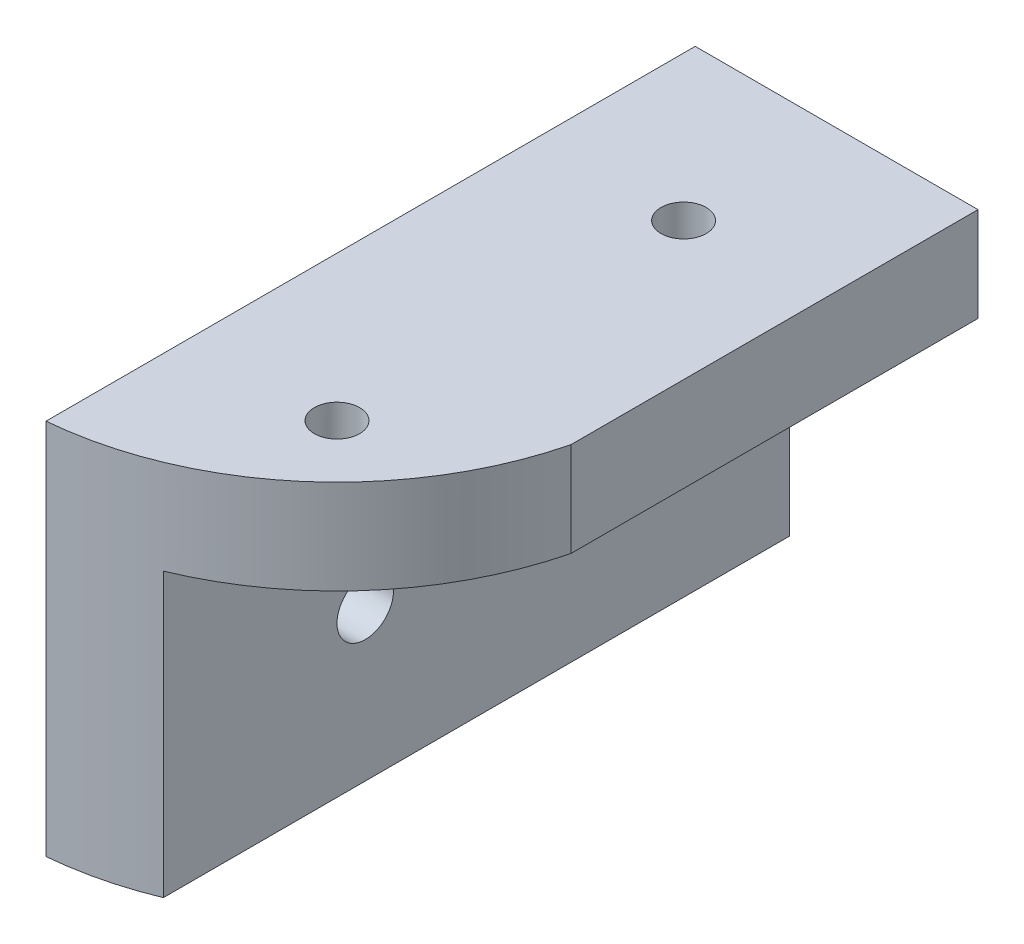
ISO-10303-21;
HEADER;
FILE_DESCRIPTION(('STEP AP214'),'2;1');
FILE_NAME('part.step','',(''),(''),'','','');
FILE_SCHEMA(('AUTOMOTIVE_DESIGN { 1 0 10303 214 1 1 1 1 }'));
ENDSEC;
DATA;
#1=APPLICATION_CONTEXT('core data for automotive mechanical design processes');
#2=APPLICATION_PROTOCOL_DEFINITION('international standard','automotive_design',2000,#1);
#3=PRODUCT_CONTEXT('',#1,'mechanical');
#4=PRODUCT('Part','Part','',(#3));
#5=PRODUCT_RELATED_PRODUCT_CATEGORY('part','',(#4));
#6=PRODUCT_DEFINITION_FORMATION('','',#4);
#7=PRODUCT_DEFINITION_CONTEXT('part definition',#1,'design');
#8=PRODUCT_DEFINITION('design','',#6,#7);
#9=PRODUCT_DEFINITION_SHAPE('','',#8);
#10=(LENGTH_UNIT() NAMED_UNIT(*) SI_UNIT(.MILLI.,.METRE.));
#11=(NAMED_UNIT(*) PLANE_ANGLE_UNIT() SI_UNIT($,.RADIAN.));
#12=(NAMED_UNIT(*) SI_UNIT($,.STERADIAN.) SOLID_ANGLE_UNIT());
#13=UNCERTAINTY_MEASURE_WITH_UNIT(LENGTH_MEASURE(1.E-05),#10,'distance_accuracy_value','');
#14=(GEOMETRIC_REPRESENTATION_CONTEXT(3) GLOBAL_UNCERTAINTY_ASSIGNED_CONTEXT((#13)) GLOBAL_UNIT_ASSIGNED_CONTEXT((#10,
#11,#12)) REPRESENTATION_CONTEXT('',''));
#15=CARTESIAN_POINT('',(0.,0.,0.));
#16=DIRECTION('',(0.,0.,1.));
#17=DIRECTION('',(1.,0.,0.));
#18=AXIS2_PLACEMENT_3D('',#15,#16,#17);
#19=CARTESIAN_POINT('',(5.,0.,35.));
#20=DIRECTION('',(0.,1.,0.));
#21=DIRECTION('',(-1.,0.,0.));
#22=AXIS2_PLACEMENT_3D('',#19,#20,#21);
#23=PLANE('',#22);
#24=DIRECTION('',(0.,0.,-1.));
#25=VECTOR('',#24,1.);
#26=CARTESIAN_POINT('',(5.,0.,35.));
#27=LINE('',#26,#25);
#28=CARTESIAN_POINT('',(5.,0.,33.208278072405));
#29=VERTEX_POINT('',#28);
#30=CARTESIAN_POINT('',(5.,0.,0.));
#31=VERTEX_POINT('',#30);
#32=EDGE_CURVE('E11',#29,#31,#27,.T.);
#33=ORIENTED_EDGE('',*,*,#32,.F.);
#34=CARTESIAN_POINT('',(-1.5,0.,17.5));
#35=DIRECTION('',(0.,1.,0.));
#36=DIRECTION('',(-1.,0.,0.));
#37=AXIS2_PLACEMENT_3D('',#34,#35,#36);
#38=CIRCLE('',#37,17.);
#39=CARTESIAN_POINT('',(0.,0.,34.4336942218761));
#40=VERTEX_POINT('',#39);
#41=EDGE_CURVE('E85',#40,#29,#38,.T.);
#42=ORIENTED_EDGE('',*,*,#41,.F.);
#43=DIRECTION('',(0.,0.,-1.));
#44=VECTOR('',#43,1.);
#45=CARTESIAN_POINT('',(0.,0.,35.));
#46=LINE('',#45,#44);
#47=CARTESIAN_POINT('',(0.,0.,0.));
#48=VERTEX_POINT('',#47);
#49=EDGE_CURVE('E55',#40,#48,#46,.T.);
#50=ORIENTED_EDGE('',*,*,#49,.T.);
#51=DIRECTION('',(1.,0.,0.));
#52=VECTOR('',#51,1.);
#53=CARTESIAN_POINT('',(5.,0.,0.));
#54=LINE('',#53,#52);
#55=EDGE_CURVE('E124',#48,#31,#54,.T.);
#56=ORIENTED_EDGE('',*,*,#55,.T.);
#57=EDGE_LOOP('',(#33,#42,#50,#56));
#58=FACE_BOUND('',#57,.T.);
#59=ADVANCED_FACE('F33',(#58),#23,.F.);
#60=CARTESIAN_POINT('',(5.,15.,35.));
#61=DIRECTION('',(-1.,0.,0.));
#62=DIRECTION('',(0.,-1.,0.));
#63=AXIS2_PLACEMENT_3D('',#60,#61,#62);
#64=PLANE('',#63);
#65=CARTESIAN_POINT('',(5.,8.,12.5));
#66=DIRECTION('',(1.,0.,0.));
#67=DIRECTION('',(0.,1.,0.));
#68=AXIS2_PLACEMENT_3D('',#65,#66,#67);
#69=CIRCLE('',#68,1.5);
#70=CARTESIAN_POINT('',(5.,9.5,12.5));
#71=VERTEX_POINT('',#70);
#72=EDGE_CURVE('E159',#71,#71,#69,.T.);
#73=ORIENTED_EDGE('',*,*,#72,.F.);
#74=EDGE_LOOP('',(#73));
#75=FACE_BOUND('',#74,.T.);
#76=CARTESIAN_POINT('',(5.,8.,22.5));
#77=DIRECTION('',(1.,0.,0.));
#78=DIRECTION('',(0.,1.,0.));
#79=AXIS2_PLACEMENT_3D('',#76,#77,#78);
#80=CIRCLE('',#79,1.5);
#81=CARTESIAN_POINT('',(5.,9.5,22.5));
#82=VERTEX_POINT('',#81);
#83=EDGE_CURVE('E153',#82,#82,#80,.T.);
#84=ORIENTED_EDGE('',*,*,#83,.F.);
#85=EDGE_LOOP('',(#84));
#86=FACE_BOUND('',#85,.T.);
#87=DIRECTION('',(0.,0.,-1.));
#88=VECTOR('',#87,1.);
#89=CARTESIAN_POINT('',(5.,15.,35.));
#90=LINE('',#89,#88);
#91=CARTESIAN_POINT('',(5.,15.,33.208278072405));
#92=VERTEX_POINT('',#91);
#93=CARTESIAN_POINT('',(5.,15.,0.));
#94=VERTEX_POINT('',#93);
#95=EDGE_CURVE('E40',#92,#94,#90,.T.);
#96=ORIENTED_EDGE('',*,*,#95,.F.);
#97=DIRECTION('',(0.,1.,0.));
#98=VECTOR('',#97,1.);
#99=CARTESIAN_POINT('',(5.,-0.00100000000000062,33.208278072405));
#100=LINE('',#99,#98);
#101=EDGE_CURVE('E92',#29,#92,#100,.T.);
#102=ORIENTED_EDGE('',*,*,#101,.F.);
#103=ORIENTED_EDGE('',*,*,#32,.T.);
#104=DIRECTION('',(0.,1.,0.));
#105=VECTOR('',#104,1.);
#106=CARTESIAN_POINT('',(5.,15.,0.));
#107=LINE('',#106,#105);
#108=EDGE_CURVE('E121',#31,#94,#107,.T.);
#109=ORIENTED_EDGE('',*,*,#108,.T.);
#110=EDGE_LOOP('',(#96,#102,#103,#109));
#111=FACE_BOUND('',#110,.T.);
#112=ADVANCED_FACE('F122',(#75,#86,#111),#64,.F.);
#113=CARTESIAN_POINT('',(15.,15.,35.));
#114=DIRECTION('',(0.,1.,0.));
#115=DIRECTION('',(-1.,0.,0.));
#116=AXIS2_PLACEMENT_3D('',#113,#114,#115);
#117=PLANE('',#116);
#118=CARTESIAN_POINT('',(7.69238815542511,15.,8.30761184457489));
#119=DIRECTION('',(0.,-1.,0.));
#120=DIRECTION('',(1.,0.,0.));
#121=AXIS2_PLACEMENT_3D('',#118,#119,#120);
#122=CIRCLE('',#121,1.2);
#123=CARTESIAN_POINT('',(8.89238815542511,15.,8.30761184457489));
#124=VERTEX_POINT('',#123);
#125=EDGE_CURVE('E147',#124,#124,#122,.T.);
#126=ORIENTED_EDGE('',*,*,#125,.F.);
#127=EDGE_LOOP('',(#126));
#128=FACE_BOUND('',#127,.T.);
#129=CARTESIAN_POINT('',(7.69238815542511,15.,26.6923881554251));
#130=DIRECTION('',(0.,-1.,0.));
#131=DIRECTION('',(1.,0.,0.));
#132=AXIS2_PLACEMENT_3D('',#129,#130,#131);
#133=CIRCLE('',#132,1.2);
#134=CARTESIAN_POINT('',(8.89238815542511,15.,26.6923881554251));
#135=VERTEX_POINT('',#134);
#136=EDGE_CURVE('E139',#135,#135,#133,.T.);
#137=ORIENTED_EDGE('',*,*,#136,.F.);
#138=EDGE_LOOP('',(#137));
#139=FACE_BOUND('',#138,.T.);
#140=DIRECTION('',(0.,0.,-1.));
#141=VECTOR('',#140,1.);
#142=CARTESIAN_POINT('',(15.,15.,35.));
#143=LINE('',#142,#141);
#144=CARTESIAN_POINT('',(15.,15.,21.5926763859363));
#145=VERTEX_POINT('',#144);
#146=CARTESIAN_POINT('',(15.,15.,0.));
#147=VERTEX_POINT('',#146);
#148=EDGE_CURVE('E107',#145,#147,#143,.T.);
#149=ORIENTED_EDGE('',*,*,#148,.F.);
#150=CARTESIAN_POINT('',(-1.5,15.,17.5));
#151=DIRECTION('',(0.,1.,0.));
#152=DIRECTION('',(-1.,0.,0.));
#153=AXIS2_PLACEMENT_3D('',#150,#151,#152);
#154=CIRCLE('',#153,17.);
#155=EDGE_CURVE('E118',#92,#145,#154,.T.);
#156=ORIENTED_EDGE('',*,*,#155,.F.);
#157=ORIENTED_EDGE('',*,*,#95,.T.);
#158=DIRECTION('',(1.,0.,0.));
#159=VECTOR('',#158,1.);
#160=CARTESIAN_POINT('',(15.,15.,0.));
#161=LINE('',#160,#159);
#162=EDGE_CURVE('E116',#94,#147,#161,.T.);
#163=ORIENTED_EDGE('',*,*,#162,.T.);
#164=EDGE_LOOP('',(#149,#156,#157,#163));
#165=FACE_BOUND('',#164,.T.);
#166=ADVANCED_FACE('F114',(#128,#139,#165),#117,.F.);
#167=CARTESIAN_POINT('',(15.,20.,35.));
#168=DIRECTION('',(-1.,0.,0.));
#169=DIRECTION('',(0.,-1.,0.));
#170=AXIS2_PLACEMENT_3D('',#167,#168,#169);
#171=PLANE('',#170);
#172=DIRECTION('',(0.,0.,-1.));
#173=VECTOR('',#172,1.);
#174=CARTESIAN_POINT('',(15.,20.,35.));
#175=LINE('',#174,#173);
#176=CARTESIAN_POINT('',(15.,20.,21.5926763859362));
#177=VERTEX_POINT('',#176);
#178=CARTESIAN_POINT('',(15.,20.,0.));
#179=VERTEX_POINT('',#178);
#180=EDGE_CURVE('E100',#177,#179,#175,.T.);
#181=ORIENTED_EDGE('',*,*,#180,.F.);
#182=DIRECTION('',(0.,1.,0.));
#183=VECTOR('',#182,1.);
#184=CARTESIAN_POINT('',(15.,-0.00100000000000672,21.5926763859363));
#185=LINE('',#184,#183);
#186=EDGE_CURVE('E89',#145,#177,#185,.T.);
#187=ORIENTED_EDGE('',*,*,#186,.F.);
#188=ORIENTED_EDGE('',*,*,#148,.T.);
#189=DIRECTION('',(0.,1.,0.));
#190=VECTOR('',#189,1.);
#191=CARTESIAN_POINT('',(15.,20.,0.));
#192=LINE('',#191,#190);
#193=EDGE_CURVE('E129',#147,#179,#192,.T.);
#194=ORIENTED_EDGE('',*,*,#193,.T.);
#195=EDGE_LOOP('',(#181,#187,#188,#194));
#196=FACE_BOUND('',#195,.T.);
#197=ADVANCED_FACE('F167',(#196),#171,.F.);
#198=CARTESIAN_POINT('',(0.,20.,35.));
#199=DIRECTION('',(0.,-1.,0.));
#200=DIRECTION('',(0.,0.,-1.));
#201=AXIS2_PLACEMENT_3D('',#198,#199,#200);
#202=PLANE('',#201);
#203=CARTESIAN_POINT('',(7.69238815542511,20.,8.30761184457489));
#204=DIRECTION('',(0.,-1.,0.));
#205=DIRECTION('',(0.,0.,-1.));
#206=AXIS2_PLACEMENT_3D('',#203,#204,#205);
#207=CIRCLE('',#206,1.2);
#208=CARTESIAN_POINT('',(7.69238815542511,20.,7.10761184457489));
#209=VERTEX_POINT('',#208);
#210=EDGE_CURVE('E144',#209,#209,#207,.F.);
#211=ORIENTED_EDGE('',*,*,#210,.F.);
#212=EDGE_LOOP('',(#211));
#213=FACE_BOUND('',#212,.T.);
#214=CARTESIAN_POINT('',(7.69238815542511,20.,26.6923881554251));
#215=DIRECTION('',(0.,-1.,0.));
#216=DIRECTION('',(0.,0.,-1.));
#217=AXIS2_PLACEMENT_3D('',#214,#215,#216);
#218=CIRCLE('',#217,1.2);
#219=CARTESIAN_POINT('',(7.69238815542511,20.,25.4923881554251));
#220=VERTEX_POINT('',#219);
#221=EDGE_CURVE('E137',#220,#220,#218,.F.);
#222=ORIENTED_EDGE('',*,*,#221,.F.);
#223=EDGE_LOOP('',(#222));
#224=FACE_BOUND('',#223,.T.);
#225=DIRECTION('',(0.,0.,-1.));
#226=VECTOR('',#225,1.);
#227=CARTESIAN_POINT('',(0.,20.,35.));
#228=LINE('',#227,#226);
#229=CARTESIAN_POINT('',(0.,20.,34.4336942218761));
#230=VERTEX_POINT('',#229);
#231=CARTESIAN_POINT('',(0.,20.,0.));
#232=VERTEX_POINT('',#231);
#233=EDGE_CURVE('E98',#230,#232,#228,.T.);
#234=ORIENTED_EDGE('',*,*,#233,.F.);
#235=CARTESIAN_POINT('',(-1.5,20.,17.5));
#236=DIRECTION('',(0.,-1.,0.));
#237=DIRECTION('',(0.,0.,-1.));
#238=AXIS2_PLACEMENT_3D('',#235,#236,#237);
#239=CIRCLE('',#238,17.);
#240=EDGE_CURVE('E47',#177,#230,#239,.T.);
#241=ORIENTED_EDGE('',*,*,#240,.F.);
#242=ORIENTED_EDGE('',*,*,#180,.T.);
#243=DIRECTION('',(-1.,0.,0.));
#244=VECTOR('',#243,1.);
#245=CARTESIAN_POINT('',(0.,20.,0.));
#246=LINE('',#245,#244);
#247=EDGE_CURVE('E102',#179,#232,#246,.T.);
#248=ORIENTED_EDGE('',*,*,#247,.T.);
#249=EDGE_LOOP('',(#234,#241,#242,#248));
#250=FACE_BOUND('',#249,.T.);
#251=ADVANCED_FACE('F135',(#213,#224,#250),#202,.F.);
#252=CARTESIAN_POINT('',(0.,0.,35.));
#253=DIRECTION('',(1.,0.,0.));
#254=DIRECTION('',(0.,0.,-1.));
#255=AXIS2_PLACEMENT_3D('',#252,#253,#254);
#256=PLANE('',#255);
#257=CARTESIAN_POINT('',(0.,8.,12.5));
#258=DIRECTION('',(1.,0.,0.));
#259=DIRECTION('',(0.,0.,-1.));
#260=AXIS2_PLACEMENT_3D('',#257,#258,#259);
#261=CIRCLE('',#260,1.5);
#262=CARTESIAN_POINT('',(0.,8.,11.));
#263=VERTEX_POINT('',#262);
#264=EDGE_CURVE('E156',#263,#263,#261,.F.);
#265=ORIENTED_EDGE('',*,*,#264,.F.);
#266=EDGE_LOOP('',(#265));
#267=FACE_BOUND('',#266,.T.);
#268=CARTESIAN_POINT('',(0.,8.,22.5));
#269=DIRECTION('',(1.,0.,0.));
#270=DIRECTION('',(0.,0.,-1.));
#271=AXIS2_PLACEMENT_3D('',#268,#269,#270);
#272=CIRCLE('',#271,1.5);
#273=CARTESIAN_POINT('',(0.,8.,21.));
#274=VERTEX_POINT('',#273);
#275=EDGE_CURVE('E150',#274,#274,#272,.F.);
#276=ORIENTED_EDGE('',*,*,#275,.F.);
#277=EDGE_LOOP('',(#276));
#278=FACE_BOUND('',#277,.T.);
#279=ORIENTED_EDGE('',*,*,#49,.F.);
#280=DIRECTION('',(0.,1.,0.));
#281=VECTOR('',#280,1.);
#282=CARTESIAN_POINT('',(0.,-0.001000000000001,34.4336942218761));
#283=LINE('',#282,#281);
#284=EDGE_CURVE('E83',#230,#40,#283,.F.);
#285=ORIENTED_EDGE('',*,*,#284,.F.);
#286=ORIENTED_EDGE('',*,*,#233,.T.);
#287=DIRECTION('',(0.,-1.,0.));
#288=VECTOR('',#287,1.);
#289=CARTESIAN_POINT('',(0.,0.,0.));
#290=LINE('',#289,#288);
#291=EDGE_CURVE('E96',#232,#48,#290,.T.);
#292=ORIENTED_EDGE('',*,*,#291,.T.);
#293=EDGE_LOOP('',(#279,#285,#286,#292));
#294=FACE_BOUND('',#293,.T.);
#295=ADVANCED_FACE('F94',(#267,#278,#294),#256,.F.);
#296=CARTESIAN_POINT('',(0.,0.,0.));
#297=DIRECTION('',(0.,0.,-1.));
#298=DIRECTION('',(-1.,0.,0.));
#299=AXIS2_PLACEMENT_3D('',#296,#297,#298);
#300=PLANE('',#299);
#301=ORIENTED_EDGE('',*,*,#55,.F.);
#302=ORIENTED_EDGE('',*,*,#291,.F.);
#303=ORIENTED_EDGE('',*,*,#247,.F.);
#304=ORIENTED_EDGE('',*,*,#193,.F.);
#305=ORIENTED_EDGE('',*,*,#162,.F.);
#306=ORIENTED_EDGE('',*,*,#108,.F.);
#307=EDGE_LOOP('',(#301,#302,#303,#304,#305,#306));
#308=FACE_BOUND('',#307,.T.);
#309=ADVANCED_FACE('F126',(#308),#300,.T.);
#310=CARTESIAN_POINT('',(7.69238815542511,20.001,26.6923881554251));
#311=DIRECTION('',(0.,-1.,0.));
#312=DIRECTION('',(1.,0.,0.));
#313=AXIS2_PLACEMENT_3D('',#310,#311,#312);
#314=CYLINDRICAL_SURFACE('',#313,1.2);
#315=ORIENTED_EDGE('',*,*,#136,.T.);
#316=EDGE_LOOP('',(#315));
#317=FACE_BOUND('',#316,.T.);
#318=ORIENTED_EDGE('',*,*,#221,.T.);
#319=EDGE_LOOP('',(#318));
#320=FACE_BOUND('',#319,.T.);
#321=ADVANCED_FACE('F203',(#317,#320),#314,.F.);
#322=CARTESIAN_POINT('',(7.69238815542511,20.001,8.30761184457489));
#323=DIRECTION('',(0.,-1.,0.));
#324=DIRECTION('',(1.,0.,0.));
#325=AXIS2_PLACEMENT_3D('',#322,#323,#324);
#326=CYLINDRICAL_SURFACE('',#325,1.2);
#327=ORIENTED_EDGE('',*,*,#125,.T.);
#328=EDGE_LOOP('',(#327));
#329=FACE_BOUND('',#328,.T.);
#330=ORIENTED_EDGE('',*,*,#210,.T.);
#331=EDGE_LOOP('',(#330));
#332=FACE_BOUND('',#331,.T.);
#333=ADVANCED_FACE('F193',(#329,#332),#326,.F.);
#334=CARTESIAN_POINT('',(-0.001000000000001,8.,22.5));
#335=DIRECTION('',(1.,0.,0.));
#336=DIRECTION('',(0.,1.,0.));
#337=AXIS2_PLACEMENT_3D('',#334,#335,#336);
#338=CYLINDRICAL_SURFACE('',#337,1.5);
#339=ORIENTED_EDGE('',*,*,#83,.T.);
#340=EDGE_LOOP('',(#339));
#341=FACE_BOUND('',#340,.T.);
#342=ORIENTED_EDGE('',*,*,#275,.T.);
#343=EDGE_LOOP('',(#342));
#344=FACE_BOUND('',#343,.T.);
#345=ADVANCED_FACE('F189',(#341,#344),#338,.F.);
#346=CARTESIAN_POINT('',(-0.001000000000001,8.,12.5));
#347=DIRECTION('',(1.,0.,0.));
#348=DIRECTION('',(0.,1.,0.));
#349=AXIS2_PLACEMENT_3D('',#346,#347,#348);
#350=CYLINDRICAL_SURFACE('',#349,1.5);
#351=ORIENTED_EDGE('',*,*,#72,.T.);
#352=EDGE_LOOP('',(#351));
#353=FACE_BOUND('',#352,.T.);
#354=ORIENTED_EDGE('',*,*,#264,.T.);
#355=EDGE_LOOP('',(#354));
#356=FACE_BOUND('',#355,.T.);
#357=ADVANCED_FACE('F192',(#353,#356),#350,.F.);
#358=CARTESIAN_POINT('',(-1.5,-0.001000000000001,17.5));
#359=DIRECTION('',(0.,1.,0.));
#360=DIRECTION('',(0.,0.,1.));
#361=AXIS2_PLACEMENT_3D('',#358,#359,#360);
#362=CYLINDRICAL_SURFACE('',#361,17.);
#363=ORIENTED_EDGE('',*,*,#186,.T.);
#364=ORIENTED_EDGE('',*,*,#240,.T.);
#365=ORIENTED_EDGE('',*,*,#284,.T.);
#366=ORIENTED_EDGE('',*,*,#41,.T.);
#367=ORIENTED_EDGE('',*,*,#101,.T.);
#368=ORIENTED_EDGE('',*,*,#155,.T.);
#369=EDGE_LOOP('',(#363,#364,#365,#366,#367,#368));
#370=FACE_BOUND('',#369,.T.);
#371=ADVANCED_FACE('F84',(#370),#362,.T.);
#372=CLOSED_SHELL('',(#59,#112,#166,#197,#251,#295,#309,#321,#333,#345,#357,#371));
#373=MANIFOLD_SOLID_BREP('B2',#372);
#374=ADVANCED_BREP_SHAPE_REPRESENTATION('',(#18,#373),#14);
#375=SHAPE_DEFINITION_REPRESENTATION(#9,#374);
ENDSEC;
END-ISO-10303-21;
